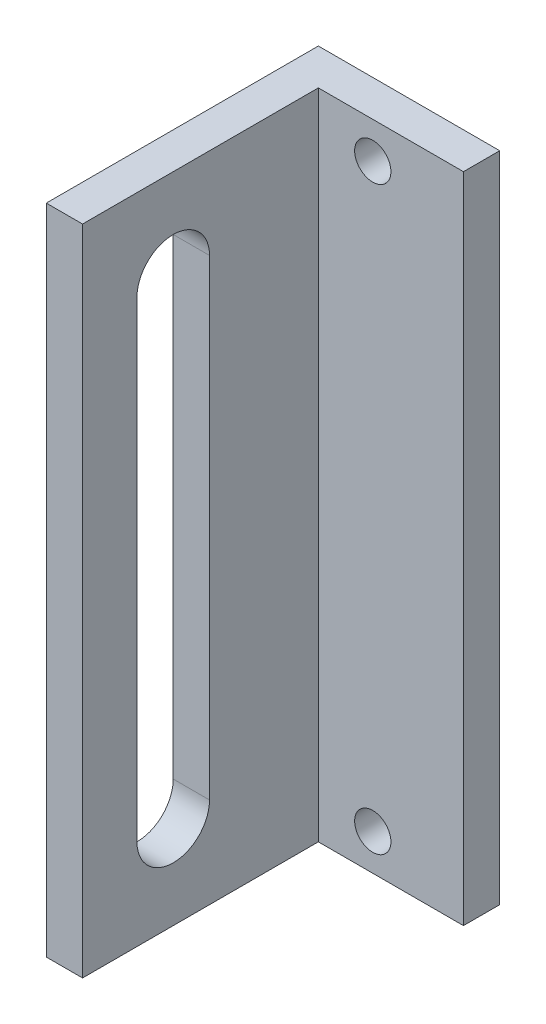
ISO-10303-21;
HEADER;
FILE_DESCRIPTION(('STEP AP214'),'2;1');
FILE_NAME('part.step','',(''),(''),'','','');
FILE_SCHEMA(('AUTOMOTIVE_DESIGN { 1 0 10303 214 1 1 1 1 }'));
ENDSEC;
DATA;
#1=APPLICATION_CONTEXT('core data for automotive mechanical design processes');
#2=APPLICATION_PROTOCOL_DEFINITION('international standard','automotive_design',2000,#1);
#3=PRODUCT_CONTEXT('',#1,'mechanical');
#4=PRODUCT('Part','Part','',(#3));
#5=PRODUCT_RELATED_PRODUCT_CATEGORY('part','',(#4));
#6=PRODUCT_DEFINITION_FORMATION('','',#4);
#7=PRODUCT_DEFINITION_CONTEXT('part definition',#1,'design');
#8=PRODUCT_DEFINITION('design','',#6,#7);
#9=PRODUCT_DEFINITION_SHAPE('','',#8);
#10=(LENGTH_UNIT() NAMED_UNIT(*) SI_UNIT(.MILLI.,.METRE.));
#11=(NAMED_UNIT(*) PLANE_ANGLE_UNIT() SI_UNIT($,.RADIAN.));
#12=(NAMED_UNIT(*) SI_UNIT($,.STERADIAN.) SOLID_ANGLE_UNIT());
#13=UNCERTAINTY_MEASURE_WITH_UNIT(LENGTH_MEASURE(1.E-05),#10,'distance_accuracy_value','');
#14=(GEOMETRIC_REPRESENTATION_CONTEXT(3) GLOBAL_UNCERTAINTY_ASSIGNED_CONTEXT((#13)) GLOBAL_UNIT_ASSIGNED_CONTEXT((#10,
#11,#12)) REPRESENTATION_CONTEXT('',''));
#15=CARTESIAN_POINT('',(0.,0.,0.));
#16=DIRECTION('',(0.,0.,1.));
#17=DIRECTION('',(1.,0.,0.));
#18=AXIS2_PLACEMENT_3D('',#15,#16,#17);
#19=CARTESIAN_POINT('',(5.,18.,2.));
#20=DIRECTION('',(-1.,0.,0.));
#21=DIRECTION('',(0.,-1.,0.));
#22=AXIS2_PLACEMENT_3D('',#19,#20,#21);
#23=PLANE('',#22);
#24=DIRECTION('',(0.,1.,0.));
#25=VECTOR('',#24,1.);
#26=CARTESIAN_POINT('',(5.,18.,0.));
#27=LINE('',#26,#25);
#28=CARTESIAN_POINT('',(5.00000000000001,-18.,0.));
#29=VERTEX_POINT('',#28);
#30=CARTESIAN_POINT('',(5.,18.,0.));
#31=VERTEX_POINT('',#30);
#32=EDGE_CURVE('E170',#29,#31,#27,.T.);
#33=ORIENTED_EDGE('',*,*,#32,.T.);
#34=DIRECTION('',(0.,0.,-1.));
#35=VECTOR('',#34,1.);
#36=CARTESIAN_POINT('',(5.,18.,2.));
#37=LINE('',#36,#35);
#38=CARTESIAN_POINT('',(5.,18.,2.));
#39=VERTEX_POINT('',#38);
#40=EDGE_CURVE('E11',#39,#31,#37,.T.);
#41=ORIENTED_EDGE('',*,*,#40,.F.);
#42=DIRECTION('',(0.,1.,0.));
#43=VECTOR('',#42,1.);
#44=CARTESIAN_POINT('',(5.,18.,2.));
#45=LINE('',#44,#43);
#46=CARTESIAN_POINT('',(5.00000000000001,-18.,2.));
#47=VERTEX_POINT('',#46);
#48=EDGE_CURVE('E179',#47,#39,#45,.T.);
#49=ORIENTED_EDGE('',*,*,#48,.F.);
#50=DIRECTION('',(0.,0.,-1.));
#51=VECTOR('',#50,1.);
#52=CARTESIAN_POINT('',(5.00000000000001,-18.,2.));
#53=LINE('',#52,#51);
#54=EDGE_CURVE('E187',#47,#29,#53,.T.);
#55=ORIENTED_EDGE('',*,*,#54,.T.);
#56=EDGE_LOOP('',(#33,#41,#49,#55));
#57=FACE_BOUND('',#56,.T.);
#58=ADVANCED_FACE('F34',(#57),#23,.F.);
#59=CARTESIAN_POINT('',(-5.,18.,2.));
#60=DIRECTION('',(0.,-1.,0.));
#61=DIRECTION('',(0.,0.,-1.));
#62=AXIS2_PLACEMENT_3D('',#59,#60,#61);
#63=PLANE('',#62);
#64=DIRECTION('',(-1.,0.,0.));
#65=VECTOR('',#64,1.);
#66=CARTESIAN_POINT('',(-5.,18.,0.));
#67=LINE('',#66,#65);
#68=CARTESIAN_POINT('',(-5.,18.,0.));
#69=VERTEX_POINT('',#68);
#70=EDGE_CURVE('E190',#31,#69,#67,.T.);
#71=ORIENTED_EDGE('',*,*,#70,.T.);
#72=DIRECTION('',(0.,0.,-1.));
#73=VECTOR('',#72,1.);
#74=CARTESIAN_POINT('',(-5.,18.,2.));
#75=LINE('',#74,#73);
#76=CARTESIAN_POINT('',(-5.,18.,15.));
#77=VERTEX_POINT('',#76);
#78=EDGE_CURVE('E41',#77,#69,#75,.T.);
#79=ORIENTED_EDGE('',*,*,#78,.F.);
#80=DIRECTION('',(-1.,0.,0.));
#81=VECTOR('',#80,1.);
#82=CARTESIAN_POINT('',(-5.,18.,15.));
#83=LINE('',#82,#81);
#84=CARTESIAN_POINT('',(-3.,18.,15.));
#85=VERTEX_POINT('',#84);
#86=EDGE_CURVE('E155',#85,#77,#83,.T.);
#87=ORIENTED_EDGE('',*,*,#86,.F.);
#88=DIRECTION('',(0.,0.,-1.));
#89=VECTOR('',#88,1.);
#90=CARTESIAN_POINT('',(-3.,18.,15.));
#91=LINE('',#90,#89);
#92=CARTESIAN_POINT('',(-3.,18.,2.));
#93=VERTEX_POINT('',#92);
#94=EDGE_CURVE('E158',#85,#93,#91,.T.);
#95=ORIENTED_EDGE('',*,*,#94,.T.);
#96=DIRECTION('',(-1.,0.,0.));
#97=VECTOR('',#96,1.);
#98=CARTESIAN_POINT('',(-5.,18.,2.));
#99=LINE('',#98,#97);
#100=EDGE_CURVE('E182',#39,#93,#99,.T.);
#101=ORIENTED_EDGE('',*,*,#100,.F.);
#102=ORIENTED_EDGE('',*,*,#40,.T.);
#103=EDGE_LOOP('',(#71,#79,#87,#95,#101,#102));
#104=FACE_BOUND('',#103,.T.);
#105=ADVANCED_FACE('F226',(#104),#63,.F.);
#106=CARTESIAN_POINT('',(-5.,18.,2.));
#107=DIRECTION('',(1.,0.,0.));
#108=DIRECTION('',(0.,1.,0.));
#109=AXIS2_PLACEMENT_3D('',#106,#107,#108);
#110=PLANE('',#109);
#111=DIRECTION('',(0.,1.,0.));
#112=VECTOR('',#111,1.);
#113=CARTESIAN_POINT('',(-5.,18.,8.));
#114=LINE('',#113,#112);
#115=CARTESIAN_POINT('',(-4.99999999999999,-13.,8.));
#116=VERTEX_POINT('',#115);
#117=CARTESIAN_POINT('',(-5.,13.,8.));
#118=VERTEX_POINT('',#117);
#119=EDGE_CURVE('E141',#116,#118,#114,.T.);
#120=ORIENTED_EDGE('',*,*,#119,.T.);
#121=CARTESIAN_POINT('',(-5.,13.,10.));
#122=DIRECTION('',(1.,0.,0.));
#123=DIRECTION('',(0.,1.,0.));
#124=AXIS2_PLACEMENT_3D('',#121,#122,#123);
#125=CIRCLE('',#124,2.);
#126=CARTESIAN_POINT('',(-5.,13.,12.));
#127=VERTEX_POINT('',#126);
#128=EDGE_CURVE('E144',#118,#127,#125,.T.);
#129=ORIENTED_EDGE('',*,*,#128,.T.);
#130=DIRECTION('',(0.,-1.,0.));
#131=VECTOR('',#130,1.);
#132=CARTESIAN_POINT('',(-5.,18.,12.));
#133=LINE('',#132,#131);
#134=CARTESIAN_POINT('',(-5.,-13.,12.));
#135=VERTEX_POINT('',#134);
#136=EDGE_CURVE('E136',#127,#135,#133,.T.);
#137=ORIENTED_EDGE('',*,*,#136,.T.);
#138=CARTESIAN_POINT('',(-4.99999999999999,-13.,9.99999999999999));
#139=DIRECTION('',(1.,0.,0.));
#140=DIRECTION('',(0.,1.,0.));
#141=AXIS2_PLACEMENT_3D('',#138,#139,#140);
#142=CIRCLE('',#141,2.);
#143=EDGE_CURVE('E116',#135,#116,#142,.T.);
#144=ORIENTED_EDGE('',*,*,#143,.T.);
#145=EDGE_LOOP('',(#120,#129,#137,#144));
#146=FACE_BOUND('',#145,.T.);
#147=DIRECTION('',(0.,-1.,0.));
#148=VECTOR('',#147,1.);
#149=CARTESIAN_POINT('',(-5.,18.,0.));
#150=LINE('',#149,#148);
#151=CARTESIAN_POINT('',(-4.99999999999999,-18.,0.));
#152=VERTEX_POINT('',#151);
#153=EDGE_CURVE('E192',#69,#152,#150,.T.);
#154=ORIENTED_EDGE('',*,*,#153,.T.);
#155=DIRECTION('',(0.,0.,-1.));
#156=VECTOR('',#155,1.);
#157=CARTESIAN_POINT('',(-4.99999999999999,-18.,2.));
#158=LINE('',#157,#156);
#159=CARTESIAN_POINT('',(-5.,-18.,15.));
#160=VERTEX_POINT('',#159);
#161=EDGE_CURVE('E197',#160,#152,#158,.T.);
#162=ORIENTED_EDGE('',*,*,#161,.F.);
#163=DIRECTION('',(0.,-1.,0.));
#164=VECTOR('',#163,1.);
#165=CARTESIAN_POINT('',(-5.,18.,15.));
#166=LINE('',#165,#164);
#167=EDGE_CURVE('E148',#77,#160,#166,.T.);
#168=ORIENTED_EDGE('',*,*,#167,.F.);
#169=ORIENTED_EDGE('',*,*,#78,.T.);
#170=EDGE_LOOP('',(#154,#162,#168,#169));
#171=FACE_BOUND('',#170,.T.);
#172=ADVANCED_FACE('F203',(#146,#171),#110,.F.);
#173=CARTESIAN_POINT('',(-4.99999999999999,-18.,2.));
#174=DIRECTION('',(0.,1.,0.));
#175=DIRECTION('',(0.,0.,1.));
#176=AXIS2_PLACEMENT_3D('',#173,#174,#175);
#177=PLANE('',#176);
#178=DIRECTION('',(1.,0.,0.));
#179=VECTOR('',#178,1.);
#180=CARTESIAN_POINT('',(-4.99999999999999,-18.,0.));
#181=LINE('',#180,#179);
#182=EDGE_CURVE('E183',#152,#29,#181,.T.);
#183=ORIENTED_EDGE('',*,*,#182,.T.);
#184=ORIENTED_EDGE('',*,*,#54,.F.);
#185=DIRECTION('',(1.,0.,0.));
#186=VECTOR('',#185,1.);
#187=CARTESIAN_POINT('',(-4.99999999999999,-18.,2.));
#188=LINE('',#187,#186);
#189=CARTESIAN_POINT('',(-3.,-18.,2.));
#190=VERTEX_POINT('',#189);
#191=EDGE_CURVE('E185',#190,#47,#188,.T.);
#192=ORIENTED_EDGE('',*,*,#191,.F.);
#193=DIRECTION('',(0.,0.,-1.));
#194=VECTOR('',#193,1.);
#195=CARTESIAN_POINT('',(-3.,-18.,15.));
#196=LINE('',#195,#194);
#197=CARTESIAN_POINT('',(-3.,-18.,15.));
#198=VERTEX_POINT('',#197);
#199=EDGE_CURVE('E163',#198,#190,#196,.T.);
#200=ORIENTED_EDGE('',*,*,#199,.F.);
#201=DIRECTION('',(1.,0.,0.));
#202=VECTOR('',#201,1.);
#203=CARTESIAN_POINT('',(-5.,-18.,15.));
#204=LINE('',#203,#202);
#205=EDGE_CURVE('E151',#160,#198,#204,.T.);
#206=ORIENTED_EDGE('',*,*,#205,.F.);
#207=ORIENTED_EDGE('',*,*,#161,.T.);
#208=EDGE_LOOP('',(#183,#184,#192,#200,#206,#207));
#209=FACE_BOUND('',#208,.T.);
#210=ADVANCED_FACE('F212',(#209),#177,.F.);
#211=CARTESIAN_POINT('',(0.,0.,2.));
#212=DIRECTION('',(0.,0.,1.));
#213=DIRECTION('',(1.,0.,0.));
#214=AXIS2_PLACEMENT_3D('',#211,#212,#213);
#215=PLANE('',#214);
#216=DIRECTION('',(0.,1.,0.));
#217=VECTOR('',#216,1.);
#218=CARTESIAN_POINT('',(-3.,18.,2.));
#219=LINE('',#218,#217);
#220=EDGE_CURVE('E147',#190,#93,#219,.T.);
#221=ORIENTED_EDGE('',*,*,#220,.F.);
#222=ORIENTED_EDGE('',*,*,#191,.T.);
#223=ORIENTED_EDGE('',*,*,#48,.T.);
#224=ORIENTED_EDGE('',*,*,#100,.T.);
#225=EDGE_LOOP('',(#221,#222,#223,#224));
#226=FACE_BOUND('',#225,.T.);
#227=CARTESIAN_POINT('',(0.,16.,2.));
#228=DIRECTION('',(0.,0.,1.));
#229=DIRECTION('',(1.,0.,0.));
#230=AXIS2_PLACEMENT_3D('',#227,#228,#229);
#231=CIRCLE('',#230,1.);
#232=CARTESIAN_POINT('',(1.,16.,2.));
#233=VERTEX_POINT('',#232);
#234=EDGE_CURVE('E171',#233,#233,#231,.T.);
#235=ORIENTED_EDGE('',*,*,#234,.F.);
#236=EDGE_LOOP('',(#235));
#237=FACE_BOUND('',#236,.T.);
#238=CARTESIAN_POINT('',(0.,-16.,2.));
#239=DIRECTION('',(0.,0.,1.));
#240=DIRECTION('',(1.,0.,0.));
#241=AXIS2_PLACEMENT_3D('',#238,#239,#240);
#242=CIRCLE('',#241,1.);
#243=CARTESIAN_POINT('',(1.,-16.,2.));
#244=VERTEX_POINT('',#243);
#245=EDGE_CURVE('E166',#244,#244,#242,.T.);
#246=ORIENTED_EDGE('',*,*,#245,.F.);
#247=EDGE_LOOP('',(#246));
#248=FACE_BOUND('',#247,.T.);
#249=ADVANCED_FACE('F219',(#226,#237,#248),#215,.T.);
#250=CARTESIAN_POINT('',(0.,0.,0.));
#251=DIRECTION('',(0.,0.,1.));
#252=DIRECTION('',(1.,0.,0.));
#253=AXIS2_PLACEMENT_3D('',#250,#251,#252);
#254=PLANE('',#253);
#255=CARTESIAN_POINT('',(0.,16.,0.));
#256=DIRECTION('',(0.,0.,1.));
#257=DIRECTION('',(1.,0.,0.));
#258=AXIS2_PLACEMENT_3D('',#255,#256,#257);
#259=CIRCLE('',#258,1.);
#260=CARTESIAN_POINT('',(1.,16.,0.));
#261=VERTEX_POINT('',#260);
#262=EDGE_CURVE('E167',#261,#261,#259,.T.);
#263=ORIENTED_EDGE('',*,*,#262,.T.);
#264=EDGE_LOOP('',(#263));
#265=FACE_BOUND('',#264,.T.);
#266=CARTESIAN_POINT('',(0.,-16.,0.));
#267=DIRECTION('',(0.,0.,1.));
#268=DIRECTION('',(1.,0.,0.));
#269=AXIS2_PLACEMENT_3D('',#266,#267,#268);
#270=CIRCLE('',#269,1.);
#271=CARTESIAN_POINT('',(1.,-16.,0.));
#272=VERTEX_POINT('',#271);
#273=EDGE_CURVE('E174',#272,#272,#270,.T.);
#274=ORIENTED_EDGE('',*,*,#273,.T.);
#275=EDGE_LOOP('',(#274));
#276=FACE_BOUND('',#275,.T.);
#277=ORIENTED_EDGE('',*,*,#32,.F.);
#278=ORIENTED_EDGE('',*,*,#182,.F.);
#279=ORIENTED_EDGE('',*,*,#153,.F.);
#280=ORIENTED_EDGE('',*,*,#70,.F.);
#281=EDGE_LOOP('',(#277,#278,#279,#280));
#282=FACE_BOUND('',#281,.T.);
#283=ADVANCED_FACE('F209',(#265,#276,#282),#254,.F.);
#284=CARTESIAN_POINT('',(0.,-16.,0.));
#285=DIRECTION('',(0.,0.,1.));
#286=DIRECTION('',(1.,0.,0.));
#287=AXIS2_PLACEMENT_3D('',#284,#285,#286);
#288=CYLINDRICAL_SURFACE('',#287,1.);
#289=ORIENTED_EDGE('',*,*,#273,.F.);
#290=EDGE_LOOP('',(#289));
#291=FACE_BOUND('',#290,.T.);
#292=ORIENTED_EDGE('',*,*,#245,.T.);
#293=EDGE_LOOP('',(#292));
#294=FACE_BOUND('',#293,.T.);
#295=ADVANCED_FACE('F239',(#291,#294),#288,.F.);
#296=CARTESIAN_POINT('',(0.,16.,0.));
#297=DIRECTION('',(0.,0.,1.));
#298=DIRECTION('',(1.,0.,0.));
#299=AXIS2_PLACEMENT_3D('',#296,#297,#298);
#300=CYLINDRICAL_SURFACE('',#299,1.);
#301=ORIENTED_EDGE('',*,*,#262,.F.);
#302=EDGE_LOOP('',(#301));
#303=FACE_BOUND('',#302,.T.);
#304=ORIENTED_EDGE('',*,*,#234,.T.);
#305=EDGE_LOOP('',(#304));
#306=FACE_BOUND('',#305,.T.);
#307=ADVANCED_FACE('F245',(#303,#306),#300,.F.);
#308=CARTESIAN_POINT('',(-3.,18.,15.));
#309=DIRECTION('',(-1.,0.,0.));
#310=DIRECTION('',(0.,-1.,0.));
#311=AXIS2_PLACEMENT_3D('',#308,#309,#310);
#312=PLANE('',#311);
#313=DIRECTION('',(0.,-1.,0.));
#314=VECTOR('',#313,1.);
#315=CARTESIAN_POINT('',(-3.,13.,12.));
#316=LINE('',#315,#314);
#317=CARTESIAN_POINT('',(-3.,13.,12.));
#318=VERTEX_POINT('',#317);
#319=CARTESIAN_POINT('',(-3.,-13.,12.));
#320=VERTEX_POINT('',#319);
#321=EDGE_CURVE('E122',#318,#320,#316,.T.);
#322=ORIENTED_EDGE('',*,*,#321,.F.);
#323=CARTESIAN_POINT('',(-3.,13.,10.));
#324=DIRECTION('',(1.,0.,0.));
#325=DIRECTION('',(0.,1.,0.));
#326=AXIS2_PLACEMENT_3D('',#323,#324,#325);
#327=CIRCLE('',#326,2.);
#328=CARTESIAN_POINT('',(-3.,13.,8.));
#329=VERTEX_POINT('',#328);
#330=EDGE_CURVE('E56',#329,#318,#327,.T.);
#331=ORIENTED_EDGE('',*,*,#330,.F.);
#332=DIRECTION('',(0.,1.,0.));
#333=VECTOR('',#332,1.);
#334=CARTESIAN_POINT('',(-3.,13.,8.));
#335=LINE('',#334,#333);
#336=CARTESIAN_POINT('',(-3.,-13.,8.));
#337=VERTEX_POINT('',#336);
#338=EDGE_CURVE('E129',#337,#329,#335,.T.);
#339=ORIENTED_EDGE('',*,*,#338,.F.);
#340=CARTESIAN_POINT('',(-3.,-13.,9.99999999999999));
#341=DIRECTION('',(1.,0.,0.));
#342=DIRECTION('',(0.,1.,0.));
#343=AXIS2_PLACEMENT_3D('',#340,#341,#342);
#344=CIRCLE('',#343,2.);
#345=EDGE_CURVE('E113',#320,#337,#344,.T.);
#346=ORIENTED_EDGE('',*,*,#345,.F.);
#347=EDGE_LOOP('',(#322,#331,#339,#346));
#348=FACE_BOUND('',#347,.T.);
#349=ORIENTED_EDGE('',*,*,#220,.T.);
#350=ORIENTED_EDGE('',*,*,#94,.F.);
#351=DIRECTION('',(0.,1.,0.));
#352=VECTOR('',#351,1.);
#353=CARTESIAN_POINT('',(-3.,18.,15.));
#354=LINE('',#353,#352);
#355=EDGE_CURVE('E153',#198,#85,#354,.T.);
#356=ORIENTED_EDGE('',*,*,#355,.F.);
#357=ORIENTED_EDGE('',*,*,#199,.T.);
#358=EDGE_LOOP('',(#349,#350,#356,#357));
#359=FACE_BOUND('',#358,.T.);
#360=ADVANCED_FACE('F126',(#348,#359),#312,.F.);
#361=CARTESIAN_POINT('',(0.,0.,15.));
#362=DIRECTION('',(0.,0.,1.));
#363=DIRECTION('',(1.,0.,0.));
#364=AXIS2_PLACEMENT_3D('',#361,#362,#363);
#365=PLANE('',#364);
#366=ORIENTED_EDGE('',*,*,#167,.T.);
#367=ORIENTED_EDGE('',*,*,#205,.T.);
#368=ORIENTED_EDGE('',*,*,#355,.T.);
#369=ORIENTED_EDGE('',*,*,#86,.T.);
#370=EDGE_LOOP('',(#366,#367,#368,#369));
#371=FACE_BOUND('',#370,.T.);
#372=ADVANCED_FACE('F225',(#371),#365,.T.);
#373=CARTESIAN_POINT('',(-13.,13.,10.));
#374=DIRECTION('',(1.,0.,0.));
#375=DIRECTION('',(0.,1.,0.));
#376=AXIS2_PLACEMENT_3D('',#373,#374,#375);
#377=CYLINDRICAL_SURFACE('',#376,2.);
#378=DIRECTION('',(1.,0.,0.));
#379=VECTOR('',#378,1.);
#380=CARTESIAN_POINT('',(-13.,13.,8.));
#381=LINE('',#380,#379);
#382=EDGE_CURVE('E134',#118,#329,#381,.T.);
#383=ORIENTED_EDGE('',*,*,#382,.T.);
#384=ORIENTED_EDGE('',*,*,#330,.T.);
#385=DIRECTION('',(1.,0.,0.));
#386=VECTOR('',#385,1.);
#387=CARTESIAN_POINT('',(-13.,13.,12.));
#388=LINE('',#387,#386);
#389=EDGE_CURVE('E119',#127,#318,#388,.T.);
#390=ORIENTED_EDGE('',*,*,#389,.F.);
#391=ORIENTED_EDGE('',*,*,#128,.F.);
#392=EDGE_LOOP('',(#383,#384,#390,#391));
#393=FACE_BOUND('',#392,.T.);
#394=ADVANCED_FACE('F254',(#393),#377,.F.);
#395=CARTESIAN_POINT('',(-13.,13.,8.));
#396=DIRECTION('',(0.,0.,-1.));
#397=DIRECTION('',(0.,1.,0.));
#398=AXIS2_PLACEMENT_3D('',#395,#396,#397);
#399=PLANE('',#398);
#400=DIRECTION('',(1.,0.,0.));
#401=VECTOR('',#400,1.);
#402=CARTESIAN_POINT('',(-13.,-13.,8.));
#403=LINE('',#402,#401);
#404=EDGE_CURVE('E118',#116,#337,#403,.T.);
#405=ORIENTED_EDGE('',*,*,#404,.T.);
#406=ORIENTED_EDGE('',*,*,#338,.T.);
#407=ORIENTED_EDGE('',*,*,#382,.F.);
#408=ORIENTED_EDGE('',*,*,#119,.F.);
#409=EDGE_LOOP('',(#405,#406,#407,#408));
#410=FACE_BOUND('',#409,.T.);
#411=ADVANCED_FACE('F257',(#410),#399,.F.);
#412=CARTESIAN_POINT('',(-13.,-13.,9.99999999999999));
#413=DIRECTION('',(1.,0.,0.));
#414=DIRECTION('',(0.,1.,0.));
#415=AXIS2_PLACEMENT_3D('',#412,#413,#414);
#416=CYLINDRICAL_SURFACE('',#415,2.);
#417=DIRECTION('',(1.,0.,0.));
#418=VECTOR('',#417,1.);
#419=CARTESIAN_POINT('',(-13.,-13.,12.));
#420=LINE('',#419,#418);
#421=EDGE_CURVE('E48',#135,#320,#420,.T.);
#422=ORIENTED_EDGE('',*,*,#421,.T.);
#423=ORIENTED_EDGE('',*,*,#345,.T.);
#424=ORIENTED_EDGE('',*,*,#404,.F.);
#425=ORIENTED_EDGE('',*,*,#143,.F.);
#426=EDGE_LOOP('',(#422,#423,#424,#425));
#427=FACE_BOUND('',#426,.T.);
#428=ADVANCED_FACE('F110',(#427),#416,.F.);
#429=CARTESIAN_POINT('',(-13.,13.,12.));
#430=DIRECTION('',(0.,0.,1.));
#431=DIRECTION('',(0.,-1.,0.));
#432=AXIS2_PLACEMENT_3D('',#429,#430,#431);
#433=PLANE('',#432);
#434=ORIENTED_EDGE('',*,*,#389,.T.);
#435=ORIENTED_EDGE('',*,*,#321,.T.);
#436=ORIENTED_EDGE('',*,*,#421,.F.);
#437=ORIENTED_EDGE('',*,*,#136,.F.);
#438=EDGE_LOOP('',(#434,#435,#436,#437));
#439=FACE_BOUND('',#438,.T.);
#440=ADVANCED_FACE('F123',(#439),#433,.F.);
#441=CLOSED_SHELL('',(#58,#105,#172,#210,#249,#283,#295,#307,#360,#372,#394,#411,#428,#440));
#442=MANIFOLD_SOLID_BREP('B2',#441);
#443=ADVANCED_BREP_SHAPE_REPRESENTATION('',(#18,#442),#14);
#444=SHAPE_DEFINITION_REPRESENTATION(#9,#443);
ENDSEC;
END-ISO-10303-21;
